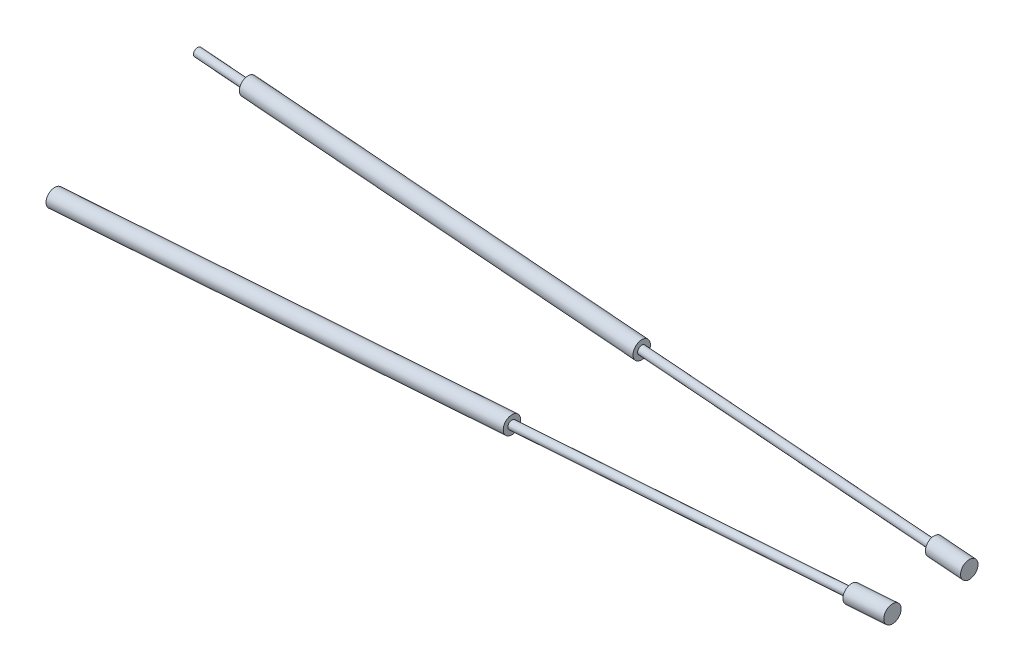
ISO-10303-21;
HEADER;
FILE_DESCRIPTION(('STEP AP214'),'2;1');
FILE_NAME('part.step','',(''),(''),'','','');
FILE_SCHEMA(('AUTOMOTIVE_DESIGN { 1 0 10303 214 1 1 1 1 }'));
ENDSEC;
DATA;
#1=APPLICATION_CONTEXT('core data for automotive mechanical design processes');
#2=APPLICATION_PROTOCOL_DEFINITION('international standard','automotive_design',2000,#1);
#3=PRODUCT_CONTEXT('',#1,'mechanical');
#4=PRODUCT('Part','Part','',(#3));
#5=PRODUCT_RELATED_PRODUCT_CATEGORY('part','',(#4));
#6=PRODUCT_DEFINITION_FORMATION('','',#4);
#7=PRODUCT_DEFINITION_CONTEXT('part definition',#1,'design');
#8=PRODUCT_DEFINITION('design','',#6,#7);
#9=PRODUCT_DEFINITION_SHAPE('','',#8);
#10=(LENGTH_UNIT() NAMED_UNIT(*) SI_UNIT(.MILLI.,.METRE.));
#11=(NAMED_UNIT(*) PLANE_ANGLE_UNIT() SI_UNIT($,.RADIAN.));
#12=(NAMED_UNIT(*) SI_UNIT($,.STERADIAN.) SOLID_ANGLE_UNIT());
#13=UNCERTAINTY_MEASURE_WITH_UNIT(LENGTH_MEASURE(1.E-05),#10,'distance_accuracy_value','');
#14=(GEOMETRIC_REPRESENTATION_CONTEXT(3) GLOBAL_UNCERTAINTY_ASSIGNED_CONTEXT((#13)) GLOBAL_UNIT_ASSIGNED_CONTEXT((#10,
#11,#12)) REPRESENTATION_CONTEXT('',''));
#15=CARTESIAN_POINT('',(0.,0.,0.));
#16=DIRECTION('',(0.,0.,1.));
#17=DIRECTION('',(1.,0.,0.));
#18=AXIS2_PLACEMENT_3D('',#15,#16,#17);
#19=CARTESIAN_POINT('',(143.095790180667,9.,7.0508783481819));
#20=DIRECTION('',(1.,0.,0.));
#21=DIRECTION('',(0.,0.,-1.));
#22=AXIS2_PLACEMENT_3D('',#19,#20,#21);
#23=CIRCLE('',#22,1.6);
#24=DIRECTION('',(-0.997216467593551,0.,0.0745608259090572));
#25=VECTOR('',#24,1.);
#26=SURFACE_OF_LINEAR_EXTRUSION('',#23,#25);
#27=CARTESIAN_POINT('',(143.095790180667,9.,5.4508783481819));
#28=VERTEX_POINT('',#27);
#29=EDGE_CURVE('E12',#28,#28,#23,.T.);
#30=ORIENTED_EDGE('',*,*,#29,.F.);
#31=EDGE_LOOP('',(#30));
#32=FACE_BOUND('',#31,.T.);
#33=CARTESIAN_POINT('',(136.115274907513,9.,7.5728041295453));
#34=DIRECTION('',(1.,0.,0.));
#35=DIRECTION('',(0.,0.,-1.));
#36=AXIS2_PLACEMENT_3D('',#33,#34,#35);
#37=CIRCLE('',#36,1.6);
#38=CARTESIAN_POINT('',(136.115274907513,9.,5.9728041295453));
#39=VERTEX_POINT('',#38);
#40=EDGE_CURVE('E62',#39,#39,#37,.T.);
#41=ORIENTED_EDGE('',*,*,#40,.T.);
#42=EDGE_LOOP('',(#41));
#43=FACE_BOUND('',#42,.T.);
#44=ADVANCED_FACE('F55',(#32,#43),#26,.F.);
#45=CARTESIAN_POINT('',(143.095790180667,9.,7.0508783481819));
#46=DIRECTION('',(1.,0.,0.));
#47=DIRECTION('',(0.,0.,-1.));
#48=AXIS2_PLACEMENT_3D('',#45,#46,#47);
#49=PLANE('',#48);
#50=ORIENTED_EDGE('',*,*,#29,.T.);
#51=EDGE_LOOP('',(#50));
#52=FACE_BOUND('',#51,.T.);
#53=ADVANCED_FACE('F71',(#52),#49,.T.);
#54=CARTESIAN_POINT('',(136.115274907513,9.,7.5728041295453));
#55=DIRECTION('',(1.,0.,0.));
#56=DIRECTION('',(0.,0.,-1.));
#57=AXIS2_PLACEMENT_3D('',#54,#55,#56);
#58=PLANE('',#57);
#59=ORIENTED_EDGE('',*,*,#40,.F.);
#60=EDGE_LOOP('',(#59));
#61=FACE_BOUND('',#60,.T.);
#62=ADVANCED_FACE('F69',(#61),#58,.F.);
#63=CLOSED_SHELL('',(#44,#53,#62));
#64=MANIFOLD_SOLID_BREP('B2',#63);
#65=CARTESIAN_POINT('',(143.095790180667,9.,-7.05087834818187));
#66=DIRECTION('',(1.,0.,0.));
#67=DIRECTION('',(0.,0.,-1.));
#68=AXIS2_PLACEMENT_3D('',#65,#66,#67);
#69=CIRCLE('',#68,1.6);
#70=DIRECTION('',(-0.997216467593551,0.,-0.0745608259090575));
#71=VECTOR('',#70,1.);
#72=SURFACE_OF_LINEAR_EXTRUSION('',#69,#71);
#73=CARTESIAN_POINT('',(143.095790180667,9.,-8.65087834818187));
#74=VERTEX_POINT('',#73);
#75=EDGE_CURVE('E121',#74,#74,#69,.T.);
#76=ORIENTED_EDGE('',*,*,#75,.F.);
#77=EDGE_LOOP('',(#76));
#78=FACE_BOUND('',#77,.T.);
#79=CARTESIAN_POINT('',(136.115274907513,9.,-7.57280412954527));
#80=DIRECTION('',(1.,0.,0.));
#81=DIRECTION('',(0.,0.,-1.));
#82=AXIS2_PLACEMENT_3D('',#79,#80,#81);
#83=CIRCLE('',#82,1.6);
#84=CARTESIAN_POINT('',(136.115274907513,9.,-9.17280412954527));
#85=VERTEX_POINT('',#84);
#86=EDGE_CURVE('E126',#85,#85,#83,.T.);
#87=ORIENTED_EDGE('',*,*,#86,.T.);
#88=EDGE_LOOP('',(#87));
#89=FACE_BOUND('',#88,.T.);
#90=ADVANCED_FACE('F105',(#78,#89),#72,.F.);
#91=CARTESIAN_POINT('',(143.095790180667,9.,-7.05087834818187));
#92=DIRECTION('',(1.,0.,0.));
#93=DIRECTION('',(0.,0.,-1.));
#94=AXIS2_PLACEMENT_3D('',#91,#92,#93);
#95=PLANE('',#94);
#96=ORIENTED_EDGE('',*,*,#75,.T.);
#97=EDGE_LOOP('',(#96));
#98=FACE_BOUND('',#97,.T.);
#99=ADVANCED_FACE('F131',(#98),#95,.T.);
#100=CARTESIAN_POINT('',(136.115274907513,9.,-7.57280412954527));
#101=DIRECTION('',(1.,0.,0.));
#102=DIRECTION('',(0.,0.,-1.));
#103=AXIS2_PLACEMENT_3D('',#100,#101,#102);
#104=PLANE('',#103);
#105=CARTESIAN_POINT('',(136.115274907513,9.,-7.57280412954526));
#106=DIRECTION('',(1.,0.,0.));
#107=DIRECTION('',(0.,0.,-1.));
#108=AXIS2_PLACEMENT_3D('',#105,#106,#107);
#109=ELLIPSE('',#108,0.752093476564697,0.75);
#110=CARTESIAN_POINT('',(136.115274907513,9.,-8.32489760610996));
#111=VERTEX_POINT('',#110);
#112=EDGE_CURVE('E117',#111,#111,#109,.F.);
#113=ORIENTED_EDGE('',*,*,#112,.F.);
#114=EDGE_LOOP('',(#113));
#115=FACE_BOUND('',#114,.T.);
#116=ORIENTED_EDGE('',*,*,#86,.F.);
#117=EDGE_LOOP('',(#116));
#118=FACE_BOUND('',#117,.T.);
#119=ADVANCED_FACE('F169',(#115,#118),#104,.F.);
#120=CARTESIAN_POINT('',(141.10135724548,9.,-7.19999999999997));
#121=DIRECTION('',(-0.997216467593551,0.,-0.0745608259090574));
#122=DIRECTION('',(-0.0745608259090574,0.,0.997216467593551));
#123=AXIS2_PLACEMENT_3D('',#120,#121,#122);
#124=CYLINDRICAL_SURFACE('',#123,0.75);
#125=CARTESIAN_POINT('',(78.1013572454803,9.,-11.9104437049721));
#126=DIRECTION('',(1.,0.,0.));
#127=DIRECTION('',(0.,0.,-1.));
#128=AXIS2_PLACEMENT_3D('',#125,#126,#127);
#129=ELLIPSE('',#128,0.752093476564697,0.75);
#130=CARTESIAN_POINT('',(78.1013572454803,9.,-12.6625371815368));
#131=VERTEX_POINT('',#130);
#132=EDGE_CURVE('E54',#131,#131,#129,.F.);
#133=ORIENTED_EDGE('',*,*,#132,.F.);
#134=EDGE_LOOP('',(#133));
#135=FACE_BOUND('',#134,.T.);
#136=ORIENTED_EDGE('',*,*,#112,.T.);
#137=EDGE_LOOP('',(#136));
#138=FACE_BOUND('',#137,.T.);
#139=ADVANCED_FACE('F107',(#135,#138),#124,.T.);
#140=CARTESIAN_POINT('',(82.6205422302254,9.,-11.5725489992103));
#141=DIRECTION('',(1.,0.,0.));
#142=DIRECTION('',(0.,0.,-1.));
#143=AXIS2_PLACEMENT_3D('',#140,#141,#142);
#144=CIRCLE('',#143,1.6);
#145=DIRECTION('',(-0.997216467593551,0.,-0.0745608259090574));
#146=VECTOR('',#145,1.);
#147=SURFACE_OF_LINEAR_EXTRUSION('',#144,#146);
#148=CARTESIAN_POINT('',(0.,9.,-17.75));
#149=DIRECTION('',(1.,0.,0.));
#150=DIRECTION('',(0.,0.,-1.));
#151=AXIS2_PLACEMENT_3D('',#148,#149,#150);
#152=CIRCLE('',#151,1.6);
#153=CARTESIAN_POINT('',(0.,9.,-19.35));
#154=VERTEX_POINT('',#153);
#155=EDGE_CURVE('E154',#154,#154,#152,.T.);
#156=ORIENTED_EDGE('',*,*,#155,.T.);
#157=EDGE_LOOP('',(#156));
#158=FACE_BOUND('',#157,.T.);
#159=CARTESIAN_POINT('',(78.1013572454803,9.,-13.5104437049721));
#160=CARTESIAN_POINT('',(78.1013572454803,9.08862207518501,-13.5104393754234));
#161=CARTESIAN_POINT('',(78.1013572454803,9.17733718839478,-13.5030535496146));
#162=CARTESIAN_POINT('',(78.1013572454803,9.35227175714498,-13.4737036873036));
#163=CARTESIAN_POINT('',(78.1013572454803,9.43849121268542,-13.4517396508013));
#164=CARTESIAN_POINT('',(78.1013572454803,9.60611934439233,-13.3938442371456));
#165=CARTESIAN_POINT('',(78.1013572454803,9.68752802055882,-13.3579128599922));
#166=CARTESIAN_POINT('',(78.1013572454803,9.84327237016396,-13.2730724421549));
#167=CARTESIAN_POINT('',(78.1013572454803,9.91760804360261,-13.224163401471));
#168=CARTESIAN_POINT('',(78.1013572454803,10.0571606269458,-13.1147169984994));
#169=CARTESIAN_POINT('',(78.1013572454803,10.1223775368503,-13.0541796362117));
#170=CARTESIAN_POINT('',(78.1013572454803,10.2418926115751,-12.9231461951266));
#171=CARTESIAN_POINT('',(78.1013572454803,10.2961907763953,-12.8526501163292));
#172=CARTESIAN_POINT('',(78.1013572454803,10.3923710682006,-12.703643645967));
#173=CARTESIAN_POINT('',(78.1013572454803,10.4342531951858,-12.6251332544021));
#174=CARTESIAN_POINT('',(78.1013572454803,10.5044461584597,-12.4622635747269));
#175=CARTESIAN_POINT('',(78.1013572454803,10.5327569947485,-12.3779042866166));
#176=CARTESIAN_POINT('',(78.1013572454803,10.5750265486041,-12.2056635594655));
#177=CARTESIAN_POINT('',(78.1013572454803,10.5889852661709,-12.1177821204247));
#178=CARTESIAN_POINT('',(78.1013572454803,10.6021655759538,-11.9409209803539));
#179=CARTESIAN_POINT('',(78.1013572454803,10.6013871681699,-11.8519412793239));
#180=CARTESIAN_POINT('',(78.1013572454803,10.5851146984673,-11.6753377964107));
#181=CARTESIAN_POINT('',(78.1013572454803,10.5696206365487,-11.5877140145276));
#182=CARTESIAN_POINT('',(78.1013572454803,10.5243442053994,-11.4162391527821));
#183=CARTESIAN_POINT('',(78.1013572454803,10.4945618361688,-11.3323880729196));
#184=CARTESIAN_POINT('',(78.1013572454803,10.4215302287078,-11.1707713418892));
#185=CARTESIAN_POINT('',(78.1013572454803,10.3782809904773,-11.0930056907213));
#186=CARTESIAN_POINT('',(78.1013572454803,10.2795085177134,-10.9457046993533));
#187=CARTESIAN_POINT('',(78.1013572454803,10.2239852831799,-10.8761693591533));
#188=CARTESIAN_POINT('',(78.1013572454803,10.1021962240353,-10.7472468688433));
#189=CARTESIAN_POINT('',(78.1013572454803,10.0359303994242,-10.6878597187334));
#190=CARTESIAN_POINT('',(78.1013572454803,9.89448386156319,-10.5808715868597));
#191=CARTESIAN_POINT('',(78.1013572454803,9.81930314831332,-10.5332706050959));
#192=CARTESIAN_POINT('',(78.1013572454803,9.66210041935288,-10.4511677096404));
#193=CARTESIAN_POINT('',(78.1013572454803,9.58007840364231,-10.4166657959487));
#194=CARTESIAN_POINT('',(78.1013572454803,9.41145534835111,-10.3617126462754));
#195=CARTESIAN_POINT('',(78.1013572454803,9.32485430877047,-10.3412614102938));
#196=CARTESIAN_POINT('',(78.1013572454803,9.14946178002725,-10.3149736889048));
#197=CARTESIAN_POINT('',(78.1013572454803,9.06067029086467,-10.3091372034975));
#198=CARTESIAN_POINT('',(78.1013572454803,8.88334585282003,-10.3122399614512));
#199=CARTESIAN_POINT('',(78.1013572454803,8.79481290393799,-10.3211792048123));
#200=CARTESIAN_POINT('',(78.1013572454803,8.62044740542485,-10.3535868638304));
#201=CARTESIAN_POINT('',(78.1013572454803,8.53461485579377,-10.3770552794873));
#202=CARTESIAN_POINT('',(78.1013572454803,8.36801753407413,-10.4378739923198));
#203=CARTESIAN_POINT('',(78.1013572454803,8.28725276198557,-10.4752242894954));
#204=CARTESIAN_POINT('',(78.1013572454803,8.1330185974551,-10.562776593442));
#205=CARTESIAN_POINT('',(78.1013572454803,8.05954920501319,-10.612978600213));
#206=CARTESIAN_POINT('',(78.1013572454803,7.92193218540162,-10.7248496838226));
#207=CARTESIAN_POINT('',(78.1013572454803,7.85778455823197,-10.7865187606611));
#208=CARTESIAN_POINT('',(78.1013572454803,7.74058034784285,-10.9196230675105));
#209=CARTESIAN_POINT('',(78.1013572454803,7.6875237646234,-10.9910582975215));
#210=CARTESIAN_POINT('',(78.1013572454803,7.59396501476173,-11.1417246300548));
#211=CARTESIAN_POINT('',(78.1013572454803,7.55346284811952,-11.2209557325771));
#212=CARTESIAN_POINT('',(78.1013572454803,7.48613003616288,-11.3850285087119));
#213=CARTESIAN_POINT('',(78.1013572454803,7.45929939084844,-11.4698701823244));
#214=CARTESIAN_POINT('',(78.1013572454803,7.42004964723392,-11.6428240520791));
#215=CARTESIAN_POINT('',(78.1013572454803,7.40763054893382,-11.7309362482214));
#216=CARTESIAN_POINT('',(78.1013572454803,7.39754643476319,-11.9080009089044));
#217=CARTESIAN_POINT('',(78.1013572454803,7.39988141889266,-11.996953373445));
#218=CARTESIAN_POINT('',(78.1013572454803,7.41924106822976,-12.17324514149));
#219=CARTESIAN_POINT('',(78.1013572454803,7.43626573343739,-12.2605844449942));
#220=CARTESIAN_POINT('',(78.1013572454803,7.48453517899678,-12.4312409530605));
#221=CARTESIAN_POINT('',(78.1013572454803,7.51577995934854,-12.5145581576225));
#222=CARTESIAN_POINT('',(78.1013572454803,7.59162787121994,-12.6748724709829));
#223=CARTESIAN_POINT('',(78.1013572454803,7.63623100273957,-12.7518695797814));
#224=CARTESIAN_POINT('',(78.1013572454803,7.73756536654505,-12.8974199987291));
#225=CARTESIAN_POINT('',(78.1013572454803,7.7942965988309,-12.9659733088784));
#226=CARTESIAN_POINT('',(78.1013572454803,7.91832257206066,-13.0927454044995));
#227=CARTESIAN_POINT('',(78.1013572454803,7.98561731300458,-13.1509641899712));
#228=CARTESIAN_POINT('',(78.1013572454803,8.12891372934712,-13.2554612316342));
#229=CARTESIAN_POINT('',(78.1013572454803,8.20491540474574,-13.3017394878254));
#230=CARTESIAN_POINT('',(78.1013572454803,8.36353130365133,-13.38107999212));
#231=CARTESIAN_POINT('',(78.1013572454803,8.44614552715831,-13.4141422402233));
#232=CARTESIAN_POINT('',(78.1013572454803,8.60595484015646,-13.4631467189996));
#233=CARTESIAN_POINT('',(78.1013572454803,8.68268107756303,-13.4806201385712));
#234=CARTESIAN_POINT('',(78.1013572454803,8.79978046748077,-13.4983718357451));
#235=CARTESIAN_POINT('',(78.1013572454803,8.83955027298213,-13.5028803542206));
#236=CARTESIAN_POINT('',(78.1013572454803,8.91953947796993,-13.5089257815732));
#237=CARTESIAN_POINT('',(78.1013572454803,8.95976014808408,-13.5104456708526));
#238=CARTESIAN_POINT('',(78.1013572454803,9.,-13.5104437049721));
#239=B_SPLINE_CURVE_WITH_KNOTS('',3,(#159,#160,#161,#162,#163,#164,#165,#166,#167,#168,#169,
#170,#171,#172,#173,#174,#175,#176,#177,#178,#179,#180,#181,#182,#183,#184,#185,#186,#187,#188,
#189,#190,#191,#192,#193,#194,#195,#196,#197,#198,#199,#200,#201,#202,#203,#204,#205,#206,#207,
#208,#209,#210,#211,#212,#213,#214,#215,#216,#217,#218,#219,#220,#221,#222,#223,#224,#225,#226,
#227,#228,#229,#230,#231,#232,#233,#234,#235,#236,#237,#238),.UNSPECIFIED.,.T.,.F.,(4,2,2,2,2,2,
2,2,2,2,2,2,2,2,2,2,2,2,2,2,2,2,2,2,2,2,2,2,2,2,2,2,2,2,2,2,2,2,2,4),(0.,0.265722179807716,
0.531444359615431,0.797166539423144,1.06288871923086,1.32861089903857,1.59433307884629,
1.860055258654,2.12577743846172,2.39149961826943,2.65722179807714,2.92294397788485,
3.18866615769257,3.45438833750028,3.720110517308,3.98583269711571,4.25155487692342,
4.51727705673113,4.78299923653885,5.04872141634656,5.31444359615428,5.58016577596199,
5.8458879557697,6.11161013557741,6.37733231538513,6.64305449519284,6.90877667500055,
7.17449885480827,7.44022103461598,7.70594321442369,7.97166539423141,8.23738757403912,
8.50310975384684,8.76883193365455,9.03455411346226,9.30027629326998,9.56599847307769,
9.80117278983423,9.92114567657169,10.0417998267246),.UNSPECIFIED.);
#240=CARTESIAN_POINT('',(78.1013572454803,9.,-13.5104437049721));
#241=VERTEX_POINT('',#240);
#242=EDGE_CURVE('E151',#241,#241,#239,.T.);
#243=ORIENTED_EDGE('',*,*,#242,.F.);
#244=EDGE_LOOP('',(#243));
#245=FACE_BOUND('',#244,.T.);
#246=ADVANCED_FACE('F165',(#158,#245),#147,.F.);
#247=CARTESIAN_POINT('',(0.,9.,-17.75));
#248=DIRECTION('',(1.,0.,0.));
#249=DIRECTION('',(0.,0.,-1.));
#250=AXIS2_PLACEMENT_3D('',#247,#248,#249);
#251=PLANE('',#250);
#252=CARTESIAN_POINT('',(0.,9.,-17.75));
#253=DIRECTION('',(1.,0.,0.));
#254=DIRECTION('',(0.,0.,-1.));
#255=AXIS2_PLACEMENT_3D('',#252,#253,#254);
#256=ELLIPSE('',#255,0.752093476564697,0.75);
#257=CARTESIAN_POINT('',(0.,9.,-18.5020934765647));
#258=VERTEX_POINT('',#257);
#259=EDGE_CURVE('E109',#258,#258,#256,.F.);
#260=ORIENTED_EDGE('',*,*,#259,.F.);
#261=EDGE_LOOP('',(#260));
#262=FACE_BOUND('',#261,.T.);
#263=ORIENTED_EDGE('',*,*,#155,.F.);
#264=EDGE_LOOP('',(#263));
#265=FACE_BOUND('',#264,.T.);
#266=ADVANCED_FACE('F144',(#262,#265),#251,.F.);
#267=CARTESIAN_POINT('',(78.1013572454803,9.,0.));
#268=DIRECTION('',(1.,0.,0.));
#269=DIRECTION('',(0.,0.,-1.));
#270=AXIS2_PLACEMENT_3D('',#267,#268,#269);
#271=PLANE('',#270);
#272=ORIENTED_EDGE('',*,*,#132,.T.);
#273=EDGE_LOOP('',(#272));
#274=FACE_BOUND('',#273,.T.);
#275=ORIENTED_EDGE('',*,*,#242,.T.);
#276=EDGE_LOOP('',(#275));
#277=FACE_BOUND('',#276,.T.);
#278=ADVANCED_FACE('F137',(#274,#277),#271,.T.);
#279=CARTESIAN_POINT('',(-9.97216467593551,9.,-18.4956082590906));
#280=DIRECTION('',(-0.997216467593551,0.,-0.0745608259090574));
#281=DIRECTION('',(-0.0745608259090574,0.,0.997216467593551));
#282=AXIS2_PLACEMENT_3D('',#279,#280,#281);
#283=PLANE('',#282);
#284=CARTESIAN_POINT('',(-9.97216467593551,9.,-18.4956082590906));
#285=DIRECTION('',(-0.997216467593551,0.,-0.0745608259090574));
#286=DIRECTION('',(-0.0745608259090574,0.,0.997216467593551));
#287=AXIS2_PLACEMENT_3D('',#284,#285,#286);
#288=CIRCLE('',#287,0.750000000000003);
#289=CARTESIAN_POINT('',(-10.0280852953673,9.,-17.7476959083954));
#290=VERTEX_POINT('',#289);
#291=EDGE_CURVE('E113',#290,#290,#288,.T.);
#292=ORIENTED_EDGE('',*,*,#291,.T.);
#293=EDGE_LOOP('',(#292));
#294=FACE_BOUND('',#293,.T.);
#295=ADVANCED_FACE('F134',(#294),#283,.T.);
#296=ORIENTED_EDGE('',*,*,#291,.F.);
#297=EDGE_LOOP('',(#296));
#298=FACE_BOUND('',#297,.T.);
#299=ORIENTED_EDGE('',*,*,#259,.T.);
#300=EDGE_LOOP('',(#299));
#301=FACE_BOUND('',#300,.T.);
#302=ADVANCED_FACE('F136',(#298,#301),#124,.T.);
#303=CLOSED_SHELL('',(#90,#99,#119,#139,#246,#266,#278,#295,#302));
#304=MANIFOLD_SOLID_BREP('B7',#303);
#305=CARTESIAN_POINT('',(141.10135724548,9.,7.20000000000001));
#306=DIRECTION('',(-0.997216467593551,0.,0.0745608259090572));
#307=DIRECTION('',(0.0745608259090572,0.,0.997216467593551));
#308=AXIS2_PLACEMENT_3D('',#305,#306,#307);
#309=PLANE('',#308);
#310=CARTESIAN_POINT('',(141.10135724548,9.,7.20000000000001));
#311=DIRECTION('',(-0.997216467593551,0.,0.0745608259090572));
#312=DIRECTION('',(0.0745608259090572,0.,0.997216467593551));
#313=AXIS2_PLACEMENT_3D('',#310,#311,#312);
#314=CIRCLE('',#313,0.750000000000001);
#315=CARTESIAN_POINT('',(141.157277864912,9.,7.94791235069517));
#316=VERTEX_POINT('',#315);
#317=EDGE_CURVE('E266',#316,#316,#314,.T.);
#318=ORIENTED_EDGE('',*,*,#317,.F.);
#319=EDGE_LOOP('',(#318));
#320=FACE_BOUND('',#319,.T.);
#321=ADVANCED_FACE('F248',(#320),#309,.F.);
#322=CARTESIAN_POINT('',(141.10135724548,9.,7.20000000000001));
#323=DIRECTION('',(-0.997216467593551,0.,0.0745608259090572));
#324=DIRECTION('',(0.0745608259090572,0.,0.997216467593551));
#325=AXIS2_PLACEMENT_3D('',#322,#323,#324);
#326=CYLINDRICAL_SURFACE('',#325,0.750000000000001);
#327=CARTESIAN_POINT('',(78.1013572454803,9.,11.9104437049722));
#328=DIRECTION('',(1.,0.,0.));
#329=DIRECTION('',(0.,0.,1.));
#330=AXIS2_PLACEMENT_3D('',#327,#328,#329);
#331=ELLIPSE('',#330,0.752093476564698,0.750000000000001);
#332=CARTESIAN_POINT('',(78.1013572454803,9.,12.6625371815369));
#333=VERTEX_POINT('',#332);
#334=EDGE_CURVE('E255',#333,#333,#331,.F.);
#335=ORIENTED_EDGE('',*,*,#334,.F.);
#336=EDGE_LOOP('',(#335));
#337=FACE_BOUND('',#336,.T.);
#338=ORIENTED_EDGE('',*,*,#317,.T.);
#339=EDGE_LOOP('',(#338));
#340=FACE_BOUND('',#339,.T.);
#341=ADVANCED_FACE('F295',(#337,#340),#326,.T.);
#342=CARTESIAN_POINT('',(82.6205422302254,9.,11.5725489992103));
#343=DIRECTION('',(1.,0.,0.));
#344=DIRECTION('',(0.,0.,-1.));
#345=AXIS2_PLACEMENT_3D('',#342,#343,#344);
#346=CIRCLE('',#345,1.6);
#347=DIRECTION('',(-0.997216467593551,0.,0.0745608259090572));
#348=VECTOR('',#347,1.);
#349=SURFACE_OF_LINEAR_EXTRUSION('',#346,#348);
#350=CARTESIAN_POINT('',(0.,9.,17.75));
#351=DIRECTION('',(1.,0.,0.));
#352=DIRECTION('',(0.,0.,-1.));
#353=AXIS2_PLACEMENT_3D('',#350,#351,#352);
#354=CIRCLE('',#353,1.6);
#355=CARTESIAN_POINT('',(0.,9.,16.15));
#356=VERTEX_POINT('',#355);
#357=EDGE_CURVE('E356',#356,#356,#354,.T.);
#358=ORIENTED_EDGE('',*,*,#357,.T.);
#359=EDGE_LOOP('',(#358));
#360=FACE_BOUND('',#359,.T.);
#361=CARTESIAN_POINT('',(78.1013572454803,9.,10.3104437049722));
#362=CARTESIAN_POINT('',(78.1013572454803,9.08862207518501,10.3104480345209));
#363=CARTESIAN_POINT('',(78.1013572454803,9.17733718839478,10.3178338603297));
#364=CARTESIAN_POINT('',(78.1013572454803,9.35227175714498,10.3471837226407));
#365=CARTESIAN_POINT('',(78.1013572454803,9.43849121268542,10.369147759143));
#366=CARTESIAN_POINT('',(78.1013572454803,9.60611934439233,10.4270431727987));
#367=CARTESIAN_POINT('',(78.1013572454803,9.68752802055882,10.4629745499521));
#368=CARTESIAN_POINT('',(78.1013572454803,9.84327237016396,10.5478149677894));
#369=CARTESIAN_POINT('',(78.1013572454803,9.91760804360261,10.5967240084733));
#370=CARTESIAN_POINT('',(78.1013572454803,10.0571606269458,10.7061704114449));
#371=CARTESIAN_POINT('',(78.1013572454803,10.1223775368503,10.7667077737326));
#372=CARTESIAN_POINT('',(78.1013572454803,10.2418926115751,10.8977412148177));
#373=CARTESIAN_POINT('',(78.1013572454803,10.2961907763953,10.9682372936151));
#374=CARTESIAN_POINT('',(78.1013572454803,10.3923710682006,11.1172437639774));
#375=CARTESIAN_POINT('',(78.1013572454803,10.4342531951858,11.1957541555422));
#376=CARTESIAN_POINT('',(78.1013572454803,10.5044461584597,11.3586238352174));
#377=CARTESIAN_POINT('',(78.1013572454803,10.5327569947485,11.4429831233277));
#378=CARTESIAN_POINT('',(78.1013572454803,10.5750265486041,11.6152238504788));
#379=CARTESIAN_POINT('',(78.1013572454803,10.5889852661709,11.7031052895196));
#380=CARTESIAN_POINT('',(78.1013572454803,10.6021655759538,11.8799664295904));
#381=CARTESIAN_POINT('',(78.1013572454803,10.6013871681699,11.9689461306205));
#382=CARTESIAN_POINT('',(78.1013572454803,10.5851146984673,12.1455496135336));
#383=CARTESIAN_POINT('',(78.1013572454803,10.5696206365487,12.2331733954167));
#384=CARTESIAN_POINT('',(78.1013572454803,10.5243442053994,12.4046482571622));
#385=CARTESIAN_POINT('',(78.1013572454803,10.4945618361688,12.4884993370247));
#386=CARTESIAN_POINT('',(78.1013572454803,10.4215302287078,12.6501160680551));
#387=CARTESIAN_POINT('',(78.1013572454803,10.3782809904773,12.727881719223));
#388=CARTESIAN_POINT('',(78.1013572454803,10.2795085177134,12.875182710591));
#389=CARTESIAN_POINT('',(78.1013572454803,10.2239852831799,12.944718050791));
#390=CARTESIAN_POINT('',(78.1013572454803,10.1021962240353,13.073640541101));
#391=CARTESIAN_POINT('',(78.1013572454803,10.0359303994242,13.1330276912109));
#392=CARTESIAN_POINT('',(78.1013572454803,9.89448386156319,13.2400158230846));
#393=CARTESIAN_POINT('',(78.1013572454803,9.81930314831332,13.2876168048484));
#394=CARTESIAN_POINT('',(78.1013572454803,9.66210041935288,13.3697197003039));
#395=CARTESIAN_POINT('',(78.1013572454803,9.58007840364231,13.4042216139956));
#396=CARTESIAN_POINT('',(78.1013572454803,9.41145534835111,13.4591747636689));
#397=CARTESIAN_POINT('',(78.1013572454803,9.32485430877047,13.4796259996505));
#398=CARTESIAN_POINT('',(78.1013572454803,9.14946178002725,13.5059137210395));
#399=CARTESIAN_POINT('',(78.1013572454803,9.06067029086467,13.5117502064468));
#400=CARTESIAN_POINT('',(78.1013572454803,8.88334585282004,13.5086474484931));
#401=CARTESIAN_POINT('',(78.1013572454803,8.79481290393799,13.499708205132));
#402=CARTESIAN_POINT('',(78.1013572454803,8.62044740542486,13.4673005461139));
#403=CARTESIAN_POINT('',(78.1013572454803,8.53461485579377,13.443832130457));
#404=CARTESIAN_POINT('',(78.1013572454803,8.36801753407413,13.3830134176245));
#405=CARTESIAN_POINT('',(78.1013572454803,8.28725276198557,13.3456631204489));
#406=CARTESIAN_POINT('',(78.1013572454803,8.13301859745511,13.2581108165023));
#407=CARTESIAN_POINT('',(78.1013572454803,8.05954920501319,13.2079088097313));
#408=CARTESIAN_POINT('',(78.1013572454803,7.92193218540162,13.0960377261217));
#409=CARTESIAN_POINT('',(78.1013572454803,7.85778455823197,13.0343686492832));
#410=CARTESIAN_POINT('',(78.1013572454803,7.74058034784286,12.9012643424338));
#411=CARTESIAN_POINT('',(78.1013572454803,7.6875237646234,12.8298291124228));
#412=CARTESIAN_POINT('',(78.1013572454803,7.59396501476173,12.6791627798895));
#413=CARTESIAN_POINT('',(78.1013572454803,7.55346284811952,12.5999316773672));
#414=CARTESIAN_POINT('',(78.1013572454803,7.48613003616288,12.4358589012324));
#415=CARTESIAN_POINT('',(78.1013572454803,7.45929939084845,12.3510172276199));
#416=CARTESIAN_POINT('',(78.1013572454803,7.42004964723392,12.1780633578652));
#417=CARTESIAN_POINT('',(78.1013572454803,7.40763054893382,12.0899511617229));
#418=CARTESIAN_POINT('',(78.1013572454803,7.39754643476319,11.9128865010399));
#419=CARTESIAN_POINT('',(78.1013572454803,7.39988141889266,11.8239340364993));
#420=CARTESIAN_POINT('',(78.1013572454803,7.41924106822976,11.6476422684544));
#421=CARTESIAN_POINT('',(78.1013572454803,7.43626573343739,11.5603029649501));
#422=CARTESIAN_POINT('',(78.1013572454803,7.48453517899677,11.3896464568838));
#423=CARTESIAN_POINT('',(78.1013572454803,7.51577995934853,11.3063292523218));
#424=CARTESIAN_POINT('',(78.1013572454803,7.59162787121993,11.1460149389614));
#425=CARTESIAN_POINT('',(78.1013572454803,7.63623100273956,11.069017830163));
#426=CARTESIAN_POINT('',(78.1013572454803,7.73756536654504,10.9234674112152));
#427=CARTESIAN_POINT('',(78.1013572454803,7.79429659883089,10.8549141010659));
#428=CARTESIAN_POINT('',(78.1013572454803,7.91832257206065,10.7281420054449));
#429=CARTESIAN_POINT('',(78.1013572454803,7.98561731300457,10.6699232199731));
#430=CARTESIAN_POINT('',(78.1013572454803,8.12891372934711,10.5654261783101));
#431=CARTESIAN_POINT('',(78.1013572454803,8.20491540474572,10.5191479221189));
#432=CARTESIAN_POINT('',(78.1013572454803,8.36353130365131,10.4398074178244));
#433=CARTESIAN_POINT('',(78.1013572454803,8.44614552715829,10.406745169721));
#434=CARTESIAN_POINT('',(78.1013572454803,8.60595484015644,10.3577406909447));
#435=CARTESIAN_POINT('',(78.1013572454803,8.68268107756301,10.3402672713731));
#436=CARTESIAN_POINT('',(78.1013572454803,8.79978046748076,10.3225155741992));
#437=CARTESIAN_POINT('',(78.1013572454803,8.83955027298212,10.3180070557238));
#438=CARTESIAN_POINT('',(78.1013572454803,8.91953947796993,10.3119616283711));
#439=CARTESIAN_POINT('',(78.1013572454803,8.95976014808408,10.3104417390917));
#440=CARTESIAN_POINT('',(78.1013572454803,9.,10.3104437049722));
#441=B_SPLINE_CURVE_WITH_KNOTS('',3,(#361,#362,#363,#364,#365,#366,#367,#368,#369,#370,#371,
#372,#373,#374,#375,#376,#377,#378,#379,#380,#381,#382,#383,#384,#385,#386,#387,#388,#389,#390,
#391,#392,#393,#394,#395,#396,#397,#398,#399,#400,#401,#402,#403,#404,#405,#406,#407,#408,#409,
#410,#411,#412,#413,#414,#415,#416,#417,#418,#419,#420,#421,#422,#423,#424,#425,#426,#427,#428,
#429,#430,#431,#432,#433,#434,#435,#436,#437,#438,#439,#440),.UNSPECIFIED.,.T.,.F.,(4,2,2,2,2,2,
2,2,2,2,2,2,2,2,2,2,2,2,2,2,2,2,2,2,2,2,2,2,2,2,2,2,2,2,2,2,2,2,2,4),(0.,0.265722179807716,
0.531444359615431,0.797166539423146,1.06288871923086,1.32861089903857,1.59433307884629,
1.860055258654,2.12577743846172,2.39149961826943,2.65722179807714,2.92294397788486,
3.18866615769257,3.45438833750028,3.720110517308,3.98583269711571,4.25155487692342,
4.51727705673114,4.78299923653885,5.04872141634656,5.31444359615427,5.58016577596198,
5.8458879557697,6.11161013557741,6.37733231538512,6.64305449519283,6.90877667500055,
7.17449885480826,7.44022103461597,7.70594321442369,7.9716653942314,8.23738757403911,
8.50310975384682,8.76883193365454,9.03455411346225,9.30027629326996,9.56599847307767,
9.80117278983422,9.92114567657169,10.0417998267246),.UNSPECIFIED.);
#442=CARTESIAN_POINT('',(78.1013572454803,9.,10.3104437049722));
#443=VERTEX_POINT('',#442);
#444=EDGE_CURVE('E276',#443,#443,#441,.T.);
#445=ORIENTED_EDGE('',*,*,#444,.F.);
#446=EDGE_LOOP('',(#445));
#447=FACE_BOUND('',#446,.T.);
#448=ADVANCED_FACE('F291',(#360,#447),#349,.F.);
#449=CARTESIAN_POINT('',(0.,9.,17.75));
#450=DIRECTION('',(1.,0.,0.));
#451=DIRECTION('',(0.,0.,-1.));
#452=AXIS2_PLACEMENT_3D('',#449,#450,#451);
#453=PLANE('',#452);
#454=DIRECTION('',(0.,1.,0.));
#455=VECTOR('',#454,1.);
#456=CARTESIAN_POINT('',(0.,9.,17.75));
#457=LINE('',#456,#455);
#458=CARTESIAN_POINT('',(0.,8.25,17.75));
#459=VERTEX_POINT('',#458);
#460=CARTESIAN_POINT('',(0.,9.75,17.75));
#461=VERTEX_POINT('',#460);
#462=EDGE_CURVE('E261',#459,#461,#457,.T.);
#463=ORIENTED_EDGE('',*,*,#462,.F.);
#464=CARTESIAN_POINT('',(0.,9.,17.75));
#465=DIRECTION('',(1.,0.,0.));
#466=DIRECTION('',(0.,0.,1.));
#467=AXIS2_PLACEMENT_3D('',#464,#465,#466);
#468=ELLIPSE('',#467,0.752093476564698,0.750000000000001);
#469=EDGE_CURVE('E103',#461,#459,#468,.F.);
#470=ORIENTED_EDGE('',*,*,#469,.F.);
#471=EDGE_LOOP('',(#463,#470));
#472=FACE_BOUND('',#471,.T.);
#473=ORIENTED_EDGE('',*,*,#357,.F.);
#474=EDGE_LOOP('',(#473));
#475=FACE_BOUND('',#474,.T.);
#476=ADVANCED_FACE('F268',(#472,#475),#453,.F.);
#477=CARTESIAN_POINT('',(78.1013572454803,9.,0.));
#478=DIRECTION('',(1.,0.,0.));
#479=DIRECTION('',(0.,0.,-1.));
#480=AXIS2_PLACEMENT_3D('',#477,#478,#479);
#481=PLANE('',#480);
#482=ORIENTED_EDGE('',*,*,#334,.T.);
#483=EDGE_LOOP('',(#482));
#484=FACE_BOUND('',#483,.T.);
#485=ORIENTED_EDGE('',*,*,#444,.T.);
#486=EDGE_LOOP('',(#485));
#487=FACE_BOUND('',#486,.T.);
#488=ADVANCED_FACE('F297',(#484,#487),#481,.T.);
#489=CARTESIAN_POINT('',(0.,9.,17.75));
#490=DIRECTION('',(-0.997216467593551,0.,0.0745608259090572));
#491=DIRECTION('',(0.0745608259090572,0.,0.997216467593551));
#492=AXIS2_PLACEMENT_3D('',#489,#490,#491);
#493=CIRCLE('',#492,0.750000000000001);
#494=EDGE_CURVE('E275',#461,#459,#493,.T.);
#495=ORIENTED_EDGE('',*,*,#494,.F.);
#496=ORIENTED_EDGE('',*,*,#469,.T.);
#497=EDGE_LOOP('',(#495,#496));
#498=FACE_BOUND('',#497,.T.);
#499=ADVANCED_FACE('F278',(#498),#326,.T.);
#500=CARTESIAN_POINT('',(0.,9.,17.75));
#501=DIRECTION('',(-0.997216467593551,0.,0.0745608259090572));
#502=DIRECTION('',(0.0745608259090572,0.,0.997216467593551));
#503=AXIS2_PLACEMENT_3D('',#500,#501,#502);
#504=PLANE('',#503);
#505=ORIENTED_EDGE('',*,*,#494,.T.);
#506=ORIENTED_EDGE('',*,*,#462,.T.);
#507=EDGE_LOOP('',(#505,#506));
#508=FACE_BOUND('',#507,.T.);
#509=ADVANCED_FACE('F274',(#508),#504,.T.);
#510=CLOSED_SHELL('',(#321,#341,#448,#476,#488,#499,#509));
#511=MANIFOLD_SOLID_BREP('B49',#510);
#512=ADVANCED_BREP_SHAPE_REPRESENTATION('',(#18,#64,#304,#511),#14);
#513=SHAPE_DEFINITION_REPRESENTATION(#9,#512);
ENDSEC;
END-ISO-10303-21;
